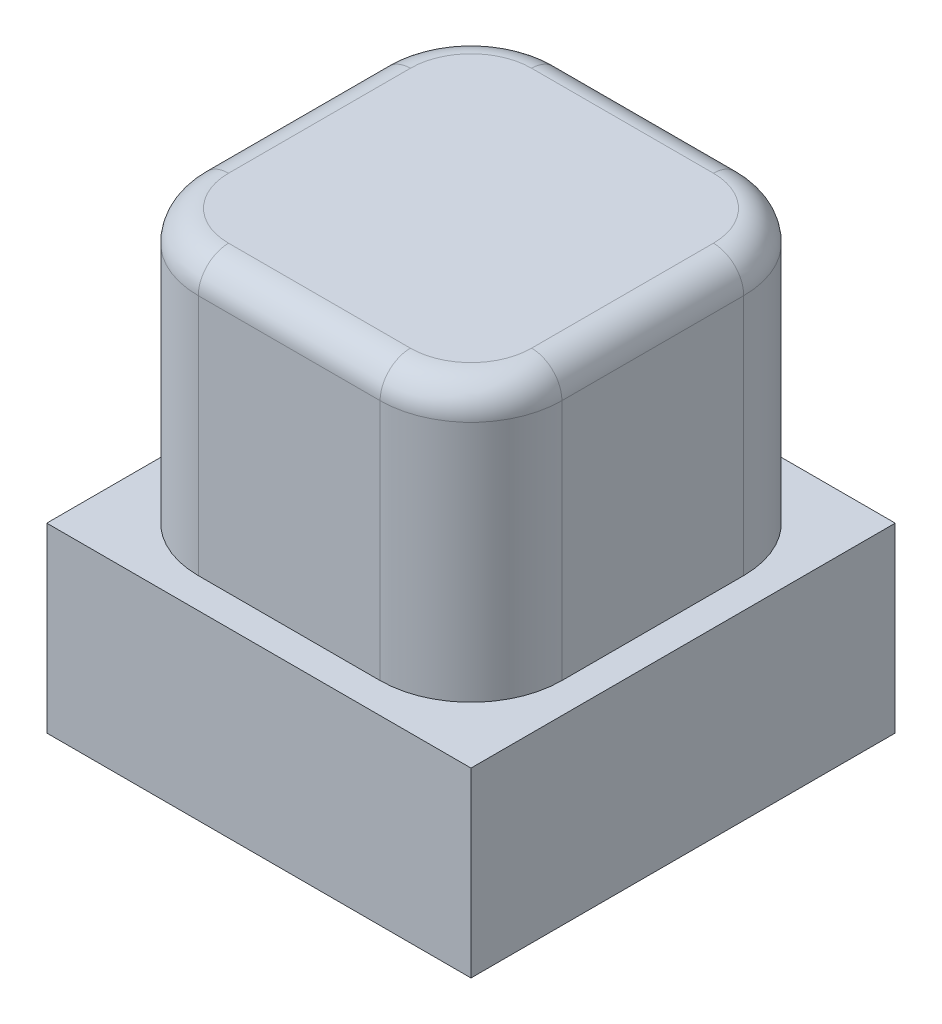
ISO-10303-21;
HEADER;
FILE_DESCRIPTION(('STEP AP214'),'2;1');
FILE_NAME('part.step','',(''),(''),'','','');
FILE_SCHEMA(('AUTOMOTIVE_DESIGN { 1 0 10303 214 1 1 1 1 }'));
ENDSEC;
DATA;
#1=APPLICATION_CONTEXT('core data for automotive mechanical design processes');
#2=APPLICATION_PROTOCOL_DEFINITION('international standard','automotive_design',2000,#1);
#3=PRODUCT_CONTEXT('',#1,'mechanical');
#4=PRODUCT('Part','Part','',(#3));
#5=PRODUCT_RELATED_PRODUCT_CATEGORY('part','',(#4));
#6=PRODUCT_DEFINITION_FORMATION('','',#4);
#7=PRODUCT_DEFINITION_CONTEXT('part definition',#1,'design');
#8=PRODUCT_DEFINITION('design','',#6,#7);
#9=PRODUCT_DEFINITION_SHAPE('','',#8);
#10=(LENGTH_UNIT() NAMED_UNIT(*) SI_UNIT(.MILLI.,.METRE.));
#11=(NAMED_UNIT(*) PLANE_ANGLE_UNIT() SI_UNIT($,.RADIAN.));
#12=(NAMED_UNIT(*) SI_UNIT($,.STERADIAN.) SOLID_ANGLE_UNIT());
#13=UNCERTAINTY_MEASURE_WITH_UNIT(LENGTH_MEASURE(1.E-05),#10,'distance_accuracy_value','');
#14=(GEOMETRIC_REPRESENTATION_CONTEXT(3) GLOBAL_UNCERTAINTY_ASSIGNED_CONTEXT((#13)) GLOBAL_UNIT_ASSIGNED_CONTEXT((#10,
#11,#12)) REPRESENTATION_CONTEXT('',''));
#15=CARTESIAN_POINT('',(0.,0.,0.));
#16=DIRECTION('',(0.,0.,1.));
#17=DIRECTION('',(1.,0.,0.));
#18=AXIS2_PLACEMENT_3D('',#15,#16,#17);
#19=CARTESIAN_POINT('',(3.5,-4.7,-3.5));
#20=DIRECTION('',(-1.,0.,0.));
#21=DIRECTION('',(0.,0.,1.));
#22=AXIS2_PLACEMENT_3D('',#19,#20,#21);
#23=PLANE('',#22);
#24=DIRECTION('',(0.,0.,1.));
#25=VECTOR('',#24,1.);
#26=CARTESIAN_POINT('',(3.5,-3.,3.5));
#27=LINE('',#26,#25);
#28=CARTESIAN_POINT('',(3.5,-3.,-3.5));
#29=VERTEX_POINT('',#28);
#30=CARTESIAN_POINT('',(3.5,-3.,3.5));
#31=VERTEX_POINT('',#30);
#32=EDGE_CURVE('E157',#29,#31,#27,.T.);
#33=ORIENTED_EDGE('',*,*,#32,.F.);
#34=DIRECTION('',(0.,1.,0.));
#35=VECTOR('',#34,1.);
#36=CARTESIAN_POINT('',(3.5,-4.7,-3.5));
#37=LINE('',#36,#35);
#38=CARTESIAN_POINT('',(3.5,0.,-3.5));
#39=VERTEX_POINT('',#38);
#40=EDGE_CURVE('E166',#29,#39,#37,.T.);
#41=ORIENTED_EDGE('',*,*,#40,.T.);
#42=DIRECTION('',(0.,0.,1.));
#43=VECTOR('',#42,1.);
#44=CARTESIAN_POINT('',(3.5,0.,-3.5));
#45=LINE('',#44,#43);
#46=CARTESIAN_POINT('',(3.5,0.,3.5));
#47=VERTEX_POINT('',#46);
#48=EDGE_CURVE('E573',#39,#47,#45,.T.);
#49=ORIENTED_EDGE('',*,*,#48,.T.);
#50=DIRECTION('',(0.,1.,0.));
#51=VECTOR('',#50,1.);
#52=CARTESIAN_POINT('',(3.5,-4.7,3.5));
#53=LINE('',#52,#51);
#54=EDGE_CURVE('E168',#31,#47,#53,.T.);
#55=ORIENTED_EDGE('',*,*,#54,.F.);
#56=EDGE_LOOP('',(#33,#41,#49,#55));
#57=FACE_BOUND('',#56,.T.);
#58=ADVANCED_FACE('F41',(#57),#23,.F.);
#59=CARTESIAN_POINT('',(-3.5,-4.7,3.5));
#60=DIRECTION('',(0.,0.,-1.));
#61=DIRECTION('',(-1.,0.,0.));
#62=AXIS2_PLACEMENT_3D('',#59,#60,#61);
#63=PLANE('',#62);
#64=DIRECTION('',(-1.,0.,0.));
#65=VECTOR('',#64,1.);
#66=CARTESIAN_POINT('',(-3.5,-3.,3.5));
#67=LINE('',#66,#65);
#68=CARTESIAN_POINT('',(-3.5,-3.,3.5));
#69=VERTEX_POINT('',#68);
#70=EDGE_CURVE('E169',#31,#69,#67,.T.);
#71=ORIENTED_EDGE('',*,*,#70,.F.);
#72=ORIENTED_EDGE('',*,*,#54,.T.);
#73=DIRECTION('',(-1.,0.,0.));
#74=VECTOR('',#73,1.);
#75=CARTESIAN_POINT('',(-3.5,0.,3.5));
#76=LINE('',#75,#74);
#77=CARTESIAN_POINT('',(-3.5,0.,3.5));
#78=VERTEX_POINT('',#77);
#79=EDGE_CURVE('E577',#47,#78,#76,.T.);
#80=ORIENTED_EDGE('',*,*,#79,.T.);
#81=DIRECTION('',(0.,1.,0.));
#82=VECTOR('',#81,1.);
#83=CARTESIAN_POINT('',(-3.5,-4.7,3.5));
#84=LINE('',#83,#82);
#85=EDGE_CURVE('E177',#69,#78,#84,.T.);
#86=ORIENTED_EDGE('',*,*,#85,.F.);
#87=EDGE_LOOP('',(#71,#72,#80,#86));
#88=FACE_BOUND('',#87,.T.);
#89=ADVANCED_FACE('F349',(#88),#63,.F.);
#90=CARTESIAN_POINT('',(-3.5,-4.7,-3.5));
#91=DIRECTION('',(1.,0.,0.));
#92=DIRECTION('',(0.,0.,-1.));
#93=AXIS2_PLACEMENT_3D('',#90,#91,#92);
#94=PLANE('',#93);
#95=DIRECTION('',(0.,0.,-1.));
#96=VECTOR('',#95,1.);
#97=CARTESIAN_POINT('',(-3.5,-3.,3.5));
#98=LINE('',#97,#96);
#99=CARTESIAN_POINT('',(-3.5,-3.,-3.5));
#100=VERTEX_POINT('',#99);
#101=EDGE_CURVE('E58',#69,#100,#98,.T.);
#102=ORIENTED_EDGE('',*,*,#101,.F.);
#103=ORIENTED_EDGE('',*,*,#85,.T.);
#104=DIRECTION('',(0.,0.,-1.));
#105=VECTOR('',#104,1.);
#106=CARTESIAN_POINT('',(-3.5,0.,-3.5));
#107=LINE('',#106,#105);
#108=CARTESIAN_POINT('',(-3.5,0.,-3.5));
#109=VERTEX_POINT('',#108);
#110=EDGE_CURVE('E179',#78,#109,#107,.T.);
#111=ORIENTED_EDGE('',*,*,#110,.T.);
#112=DIRECTION('',(0.,1.,0.));
#113=VECTOR('',#112,1.);
#114=CARTESIAN_POINT('',(-3.5,-4.7,-3.5));
#115=LINE('',#114,#113);
#116=EDGE_CURVE('E175',#100,#109,#115,.T.);
#117=ORIENTED_EDGE('',*,*,#116,.F.);
#118=EDGE_LOOP('',(#102,#103,#111,#117));
#119=FACE_BOUND('',#118,.T.);
#120=ADVANCED_FACE('F354',(#119),#94,.F.);
#121=CARTESIAN_POINT('',(-3.5,-4.7,-3.5));
#122=DIRECTION('',(0.,0.,1.));
#123=DIRECTION('',(1.,0.,0.));
#124=AXIS2_PLACEMENT_3D('',#121,#122,#123);
#125=PLANE('',#124);
#126=DIRECTION('',(1.,0.,0.));
#127=VECTOR('',#126,1.);
#128=CARTESIAN_POINT('',(-3.5,-3.,-3.5));
#129=LINE('',#128,#127);
#130=EDGE_CURVE('E153',#100,#29,#129,.T.);
#131=ORIENTED_EDGE('',*,*,#130,.F.);
#132=ORIENTED_EDGE('',*,*,#116,.T.);
#133=DIRECTION('',(1.,0.,0.));
#134=VECTOR('',#133,1.);
#135=CARTESIAN_POINT('',(-3.5,0.,-3.5));
#136=LINE('',#135,#134);
#137=EDGE_CURVE('E173',#109,#39,#136,.T.);
#138=ORIENTED_EDGE('',*,*,#137,.T.);
#139=ORIENTED_EDGE('',*,*,#40,.F.);
#140=EDGE_LOOP('',(#131,#132,#138,#139));
#141=FACE_BOUND('',#140,.T.);
#142=ADVANCED_FACE('F171',(#141),#125,.F.);
#143=CARTESIAN_POINT('',(3.,4.5,3.));
#144=DIRECTION('',(-1.,0.,0.));
#145=DIRECTION('',(0.,0.,1.));
#146=AXIS2_PLACEMENT_3D('',#143,#144,#145);
#147=PLANE('',#146);
#148=DIRECTION('',(0.,-1.,0.));
#149=VECTOR('',#148,1.);
#150=CARTESIAN_POINT('',(3.,4.5,-1.5));
#151=LINE('',#150,#149);
#152=CARTESIAN_POINT('',(3.,0.,-1.5));
#153=VERTEX_POINT('',#152);
#154=CARTESIAN_POINT('',(3.,4.,-1.5));
#155=VERTEX_POINT('',#154);
#156=EDGE_CURVE('E220',#153,#155,#151,.F.);
#157=ORIENTED_EDGE('',*,*,#156,.T.);
#158=DIRECTION('',(0.,0.,-1.));
#159=VECTOR('',#158,1.);
#160=CARTESIAN_POINT('',(3.,4.,3.));
#161=LINE('',#160,#159);
#162=CARTESIAN_POINT('',(3.,4.,1.5));
#163=VERTEX_POINT('',#162);
#164=EDGE_CURVE('E66',#155,#163,#161,.F.);
#165=ORIENTED_EDGE('',*,*,#164,.T.);
#166=DIRECTION('',(0.,-1.,0.));
#167=VECTOR('',#166,1.);
#168=CARTESIAN_POINT('',(3.,4.5,1.5));
#169=LINE('',#168,#167);
#170=CARTESIAN_POINT('',(3.,0.,1.5));
#171=VERTEX_POINT('',#170);
#172=EDGE_CURVE('E218',#163,#171,#169,.T.);
#173=ORIENTED_EDGE('',*,*,#172,.T.);
#174=DIRECTION('',(0.,0.,-1.));
#175=VECTOR('',#174,1.);
#176=CARTESIAN_POINT('',(3.,0.,3.));
#177=LINE('',#176,#175);
#178=EDGE_CURVE('E186',#171,#153,#177,.T.);
#179=ORIENTED_EDGE('',*,*,#178,.T.);
#180=EDGE_LOOP('',(#157,#165,#173,#179));
#181=FACE_BOUND('',#180,.T.);
#182=ADVANCED_FACE('F290',(#181),#147,.F.);
#183=CARTESIAN_POINT('',(-3.,4.5,-3.));
#184=DIRECTION('',(0.,0.,1.));
#185=DIRECTION('',(1.,0.,0.));
#186=AXIS2_PLACEMENT_3D('',#183,#184,#185);
#187=PLANE('',#186);
#188=DIRECTION('',(0.,-1.,0.));
#189=VECTOR('',#188,1.);
#190=CARTESIAN_POINT('',(-1.5,4.5,-3.));
#191=LINE('',#190,#189);
#192=CARTESIAN_POINT('',(-1.5,0.,-3.));
#193=VERTEX_POINT('',#192);
#194=CARTESIAN_POINT('',(-1.5,4.,-3.));
#195=VERTEX_POINT('',#194);
#196=EDGE_CURVE('E215',#193,#195,#191,.F.);
#197=ORIENTED_EDGE('',*,*,#196,.T.);
#198=DIRECTION('',(-1.,0.,0.));
#199=VECTOR('',#198,1.);
#200=CARTESIAN_POINT('',(-3.,4.,-3.));
#201=LINE('',#200,#199);
#202=CARTESIAN_POINT('',(1.5,4.,-3.));
#203=VERTEX_POINT('',#202);
#204=EDGE_CURVE('E253',#195,#203,#201,.F.);
#205=ORIENTED_EDGE('',*,*,#204,.T.);
#206=DIRECTION('',(0.,-1.,0.));
#207=VECTOR('',#206,1.);
#208=CARTESIAN_POINT('',(1.5,4.5,-3.));
#209=LINE('',#208,#207);
#210=CARTESIAN_POINT('',(1.5,0.,-3.));
#211=VERTEX_POINT('',#210);
#212=EDGE_CURVE('E213',#203,#211,#209,.T.);
#213=ORIENTED_EDGE('',*,*,#212,.T.);
#214=DIRECTION('',(-1.,0.,0.));
#215=VECTOR('',#214,1.);
#216=CARTESIAN_POINT('',(-3.,0.,-3.));
#217=LINE('',#216,#215);
#218=EDGE_CURVE('E188',#211,#193,#217,.T.);
#219=ORIENTED_EDGE('',*,*,#218,.T.);
#220=EDGE_LOOP('',(#197,#205,#213,#219));
#221=FACE_BOUND('',#220,.T.);
#222=ADVANCED_FACE('F301',(#221),#187,.F.);
#223=CARTESIAN_POINT('',(-3.,4.5,3.));
#224=DIRECTION('',(1.,0.,0.));
#225=DIRECTION('',(0.,0.,-1.));
#226=AXIS2_PLACEMENT_3D('',#223,#224,#225);
#227=PLANE('',#226);
#228=DIRECTION('',(0.,-1.,0.));
#229=VECTOR('',#228,1.);
#230=CARTESIAN_POINT('',(-3.,4.5,1.5));
#231=LINE('',#230,#229);
#232=CARTESIAN_POINT('',(-3.,0.,1.5));
#233=VERTEX_POINT('',#232);
#234=CARTESIAN_POINT('',(-3.,4.,1.5));
#235=VERTEX_POINT('',#234);
#236=EDGE_CURVE('E196',#233,#235,#231,.F.);
#237=ORIENTED_EDGE('',*,*,#236,.T.);
#238=DIRECTION('',(0.,0.,1.));
#239=VECTOR('',#238,1.);
#240=CARTESIAN_POINT('',(-3.,4.,3.));
#241=LINE('',#240,#239);
#242=CARTESIAN_POINT('',(-3.,4.,-1.5));
#243=VERTEX_POINT('',#242);
#244=EDGE_CURVE('E50',#235,#243,#241,.F.);
#245=ORIENTED_EDGE('',*,*,#244,.T.);
#246=DIRECTION('',(0.,-1.,0.));
#247=VECTOR('',#246,1.);
#248=CARTESIAN_POINT('',(-3.,4.5,-1.5));
#249=LINE('',#248,#247);
#250=CARTESIAN_POINT('',(-3.,0.,-1.5));
#251=VERTEX_POINT('',#250);
#252=EDGE_CURVE('E199',#243,#251,#249,.T.);
#253=ORIENTED_EDGE('',*,*,#252,.T.);
#254=DIRECTION('',(0.,0.,1.));
#255=VECTOR('',#254,1.);
#256=CARTESIAN_POINT('',(-3.,0.,3.));
#257=LINE('',#256,#255);
#258=EDGE_CURVE('E191',#251,#233,#257,.T.);
#259=ORIENTED_EDGE('',*,*,#258,.T.);
#260=EDGE_LOOP('',(#237,#245,#253,#259));
#261=FACE_BOUND('',#260,.T.);
#262=ADVANCED_FACE('F339',(#261),#227,.F.);
#263=CARTESIAN_POINT('',(-3.,4.5,3.));
#264=DIRECTION('',(0.,0.,-1.));
#265=DIRECTION('',(-1.,0.,0.));
#266=AXIS2_PLACEMENT_3D('',#263,#264,#265);
#267=PLANE('',#266);
#268=DIRECTION('',(0.,-1.,0.));
#269=VECTOR('',#268,1.);
#270=CARTESIAN_POINT('',(1.5,4.5,3.));
#271=LINE('',#270,#269);
#272=CARTESIAN_POINT('',(1.5,0.,3.));
#273=VERTEX_POINT('',#272);
#274=CARTESIAN_POINT('',(1.5,4.,3.));
#275=VERTEX_POINT('',#274);
#276=EDGE_CURVE('E224',#273,#275,#271,.F.);
#277=ORIENTED_EDGE('',*,*,#276,.T.);
#278=DIRECTION('',(1.,0.,0.));
#279=VECTOR('',#278,1.);
#280=CARTESIAN_POINT('',(-3.,4.,3.));
#281=LINE('',#280,#279);
#282=CARTESIAN_POINT('',(-1.5,4.,3.));
#283=VERTEX_POINT('',#282);
#284=EDGE_CURVE('E12',#275,#283,#281,.F.);
#285=ORIENTED_EDGE('',*,*,#284,.T.);
#286=DIRECTION('',(0.,-1.,0.));
#287=VECTOR('',#286,1.);
#288=CARTESIAN_POINT('',(-1.5,4.5,3.));
#289=LINE('',#288,#287);
#290=CARTESIAN_POINT('',(-1.5,0.,3.));
#291=VERTEX_POINT('',#290);
#292=EDGE_CURVE('E222',#283,#291,#289,.T.);
#293=ORIENTED_EDGE('',*,*,#292,.T.);
#294=DIRECTION('',(1.,0.,0.));
#295=VECTOR('',#294,1.);
#296=CARTESIAN_POINT('',(-3.,0.,3.));
#297=LINE('',#296,#295);
#298=EDGE_CURVE('E194',#291,#273,#297,.T.);
#299=ORIENTED_EDGE('',*,*,#298,.T.);
#300=EDGE_LOOP('',(#277,#285,#293,#299));
#301=FACE_BOUND('',#300,.T.);
#302=ADVANCED_FACE('F332',(#301),#267,.F.);
#303=CARTESIAN_POINT('',(0.,4.5,0.));
#304=DIRECTION('',(0.,-1.,0.));
#305=DIRECTION('',(0.,0.,-1.));
#306=AXIS2_PLACEMENT_3D('',#303,#304,#305);
#307=PLANE('',#306);
#308=CARTESIAN_POINT('',(1.5,4.5,-1.5));
#309=DIRECTION('',(0.,-1.,0.));
#310=DIRECTION('',(0.,0.,-1.));
#311=AXIS2_PLACEMENT_3D('',#308,#309,#310);
#312=CIRCLE('',#311,1.);
#313=CARTESIAN_POINT('',(2.5,4.5,-1.5));
#314=VERTEX_POINT('',#313);
#315=CARTESIAN_POINT('',(1.5,4.5,-2.5));
#316=VERTEX_POINT('',#315);
#317=EDGE_CURVE('E238',#314,#316,#312,.F.);
#318=ORIENTED_EDGE('',*,*,#317,.T.);
#319=DIRECTION('',(-1.,0.,0.));
#320=VECTOR('',#319,1.);
#321=CARTESIAN_POINT('',(0.,4.5,-2.5));
#322=LINE('',#321,#320);
#323=CARTESIAN_POINT('',(-1.5,4.5,-2.5));
#324=VERTEX_POINT('',#323);
#325=EDGE_CURVE('E242',#316,#324,#322,.T.);
#326=ORIENTED_EDGE('',*,*,#325,.T.);
#327=CARTESIAN_POINT('',(-1.5,4.5,-1.5));
#328=DIRECTION('',(0.,-1.,0.));
#329=DIRECTION('',(0.,0.,-1.));
#330=AXIS2_PLACEMENT_3D('',#327,#328,#329);
#331=CIRCLE('',#330,1.);
#332=CARTESIAN_POINT('',(-2.5,4.5,-1.5));
#333=VERTEX_POINT('',#332);
#334=EDGE_CURVE('E240',#324,#333,#331,.F.);
#335=ORIENTED_EDGE('',*,*,#334,.T.);
#336=DIRECTION('',(0.,0.,1.));
#337=VECTOR('',#336,1.);
#338=CARTESIAN_POINT('',(-2.5,4.5,0.));
#339=LINE('',#338,#337);
#340=CARTESIAN_POINT('',(-2.5,4.5,1.5));
#341=VERTEX_POINT('',#340);
#342=EDGE_CURVE('E234',#333,#341,#339,.T.);
#343=ORIENTED_EDGE('',*,*,#342,.T.);
#344=CARTESIAN_POINT('',(-1.5,4.5,1.5));
#345=DIRECTION('',(0.,-1.,0.));
#346=DIRECTION('',(0.,0.,-1.));
#347=AXIS2_PLACEMENT_3D('',#344,#345,#346);
#348=CIRCLE('',#347,1.);
#349=CARTESIAN_POINT('',(-1.5,4.5,2.5));
#350=VERTEX_POINT('',#349);
#351=EDGE_CURVE('E231',#341,#350,#348,.F.);
#352=ORIENTED_EDGE('',*,*,#351,.T.);
#353=DIRECTION('',(1.,0.,0.));
#354=VECTOR('',#353,1.);
#355=CARTESIAN_POINT('',(0.,4.5,2.5));
#356=LINE('',#355,#354);
#357=CARTESIAN_POINT('',(1.5,4.5,2.5));
#358=VERTEX_POINT('',#357);
#359=EDGE_CURVE('E227',#350,#358,#356,.T.);
#360=ORIENTED_EDGE('',*,*,#359,.T.);
#361=CARTESIAN_POINT('',(1.5,4.5,1.5));
#362=DIRECTION('',(0.,-1.,0.));
#363=DIRECTION('',(0.,0.,-1.));
#364=AXIS2_PLACEMENT_3D('',#361,#362,#363);
#365=CIRCLE('',#364,1.);
#366=CARTESIAN_POINT('',(2.5,4.5,1.5));
#367=VERTEX_POINT('',#366);
#368=EDGE_CURVE('E229',#358,#367,#365,.F.);
#369=ORIENTED_EDGE('',*,*,#368,.T.);
#370=DIRECTION('',(0.,0.,-1.));
#371=VECTOR('',#370,1.);
#372=CARTESIAN_POINT('',(2.5,4.5,0.));
#373=LINE('',#372,#371);
#374=EDGE_CURVE('E236',#367,#314,#373,.T.);
#375=ORIENTED_EDGE('',*,*,#374,.T.);
#376=EDGE_LOOP('',(#318,#326,#335,#343,#352,#360,#369,#375));
#377=FACE_BOUND('',#376,.T.);
#378=ADVANCED_FACE('F317',(#377),#307,.F.);
#379=CARTESIAN_POINT('',(-1.5,4.5,-1.5));
#380=DIRECTION('',(0.,-1.,0.));
#381=DIRECTION('',(0.,0.,-1.));
#382=AXIS2_PLACEMENT_3D('',#379,#380,#381);
#383=CYLINDRICAL_SURFACE('',#382,1.5);
#384=ORIENTED_EDGE('',*,*,#252,.F.);
#385=CARTESIAN_POINT('',(-1.5,4.,-1.5));
#386=DIRECTION('',(0.,-1.,0.));
#387=DIRECTION('',(0.,0.,-1.));
#388=AXIS2_PLACEMENT_3D('',#385,#386,#387);
#389=CIRCLE('',#388,1.5);
#390=EDGE_CURVE('E247',#243,#195,#389,.T.);
#391=ORIENTED_EDGE('',*,*,#390,.T.);
#392=ORIENTED_EDGE('',*,*,#196,.F.);
#393=CARTESIAN_POINT('',(-1.5,0.,-1.5));
#394=DIRECTION('',(0.,-1.,0.));
#395=DIRECTION('',(0.,0.,-1.));
#396=AXIS2_PLACEMENT_3D('',#393,#394,#395);
#397=CIRCLE('',#396,1.5);
#398=EDGE_CURVE('E210',#251,#193,#397,.T.);
#399=ORIENTED_EDGE('',*,*,#398,.F.);
#400=EDGE_LOOP('',(#384,#391,#392,#399));
#401=FACE_BOUND('',#400,.T.);
#402=ADVANCED_FACE('F304',(#401),#383,.T.);
#403=CARTESIAN_POINT('',(1.5,4.5,-1.5));
#404=DIRECTION('',(0.,-1.,0.));
#405=DIRECTION('',(0.,0.,-1.));
#406=AXIS2_PLACEMENT_3D('',#403,#404,#405);
#407=CYLINDRICAL_SURFACE('',#406,1.5);
#408=ORIENTED_EDGE('',*,*,#212,.F.);
#409=CARTESIAN_POINT('',(1.5,4.,-1.5));
#410=DIRECTION('',(0.,-1.,0.));
#411=DIRECTION('',(0.,0.,-1.));
#412=AXIS2_PLACEMENT_3D('',#409,#410,#411);
#413=CIRCLE('',#412,1.5);
#414=EDGE_CURVE('E249',#203,#155,#413,.T.);
#415=ORIENTED_EDGE('',*,*,#414,.T.);
#416=ORIENTED_EDGE('',*,*,#156,.F.);
#417=CARTESIAN_POINT('',(1.5,0.,-1.5));
#418=DIRECTION('',(0.,-1.,0.));
#419=DIRECTION('',(0.,0.,-1.));
#420=AXIS2_PLACEMENT_3D('',#417,#418,#419);
#421=CIRCLE('',#420,1.5);
#422=EDGE_CURVE('E207',#211,#153,#421,.T.);
#423=ORIENTED_EDGE('',*,*,#422,.F.);
#424=EDGE_LOOP('',(#408,#415,#416,#423));
#425=FACE_BOUND('',#424,.T.);
#426=ADVANCED_FACE('F288',(#425),#407,.T.);
#427=CARTESIAN_POINT('',(1.5,4.5,1.5));
#428=DIRECTION('',(0.,-1.,0.));
#429=DIRECTION('',(0.,0.,-1.));
#430=AXIS2_PLACEMENT_3D('',#427,#428,#429);
#431=CYLINDRICAL_SURFACE('',#430,1.5);
#432=ORIENTED_EDGE('',*,*,#172,.F.);
#433=CARTESIAN_POINT('',(1.5,4.,1.5));
#434=DIRECTION('',(0.,-1.,0.));
#435=DIRECTION('',(0.,0.,-1.));
#436=AXIS2_PLACEMENT_3D('',#433,#434,#435);
#437=CIRCLE('',#436,1.5);
#438=EDGE_CURVE('E251',#163,#275,#437,.T.);
#439=ORIENTED_EDGE('',*,*,#438,.T.);
#440=ORIENTED_EDGE('',*,*,#276,.F.);
#441=CARTESIAN_POINT('',(1.5,0.,1.5));
#442=DIRECTION('',(0.,-1.,0.));
#443=DIRECTION('',(0.,0.,-1.));
#444=AXIS2_PLACEMENT_3D('',#441,#442,#443);
#445=CIRCLE('',#444,1.5);
#446=EDGE_CURVE('E204',#171,#273,#445,.T.);
#447=ORIENTED_EDGE('',*,*,#446,.F.);
#448=EDGE_LOOP('',(#432,#439,#440,#447));
#449=FACE_BOUND('',#448,.T.);
#450=ADVANCED_FACE('F330',(#449),#431,.T.);
#451=CARTESIAN_POINT('',(-1.5,4.5,1.5));
#452=DIRECTION('',(0.,-1.,0.));
#453=DIRECTION('',(0.,0.,-1.));
#454=AXIS2_PLACEMENT_3D('',#451,#452,#453);
#455=CYLINDRICAL_SURFACE('',#454,1.5);
#456=ORIENTED_EDGE('',*,*,#292,.F.);
#457=CARTESIAN_POINT('',(-1.5,4.,1.5));
#458=DIRECTION('',(0.,-1.,0.));
#459=DIRECTION('',(0.,0.,-1.));
#460=AXIS2_PLACEMENT_3D('',#457,#458,#459);
#461=CIRCLE('',#460,1.5);
#462=EDGE_CURVE('E244',#283,#235,#461,.T.);
#463=ORIENTED_EDGE('',*,*,#462,.T.);
#464=ORIENTED_EDGE('',*,*,#236,.F.);
#465=CARTESIAN_POINT('',(-1.5,0.,1.5));
#466=DIRECTION('',(0.,-1.,0.));
#467=DIRECTION('',(0.,0.,-1.));
#468=AXIS2_PLACEMENT_3D('',#465,#466,#467);
#469=CIRCLE('',#468,1.5);
#470=EDGE_CURVE('E201',#291,#233,#469,.T.);
#471=ORIENTED_EDGE('',*,*,#470,.F.);
#472=EDGE_LOOP('',(#456,#463,#464,#471));
#473=FACE_BOUND('',#472,.T.);
#474=ADVANCED_FACE('F336',(#473),#455,.T.);
#475=CARTESIAN_POINT('',(1.5,4.,-1.5));
#476=DIRECTION('',(0.,-1.,0.));
#477=DIRECTION('',(0.,0.,-1.));
#478=AXIS2_PLACEMENT_3D('',#475,#476,#477);
#479=TOROIDAL_SURFACE('',#478,1.,0.5);
#480=CARTESIAN_POINT('',(2.5,4.,-1.5));
#481=DIRECTION('',(0.,0.,1.));
#482=DIRECTION('',(1.,0.,0.));
#483=AXIS2_PLACEMENT_3D('',#480,#481,#482);
#484=CIRCLE('',#483,0.5);
#485=EDGE_CURVE('E272',#155,#314,#484,.T.);
#486=ORIENTED_EDGE('',*,*,#485,.F.);
#487=ORIENTED_EDGE('',*,*,#414,.F.);
#488=CARTESIAN_POINT('',(1.5,4.,-2.5));
#489=DIRECTION('',(-1.,0.,0.));
#490=DIRECTION('',(0.,0.,1.));
#491=AXIS2_PLACEMENT_3D('',#488,#489,#490);
#492=CIRCLE('',#491,0.5);
#493=EDGE_CURVE('E189',#316,#203,#492,.T.);
#494=ORIENTED_EDGE('',*,*,#493,.F.);
#495=ORIENTED_EDGE('',*,*,#317,.F.);
#496=EDGE_LOOP('',(#486,#487,#494,#495));
#497=FACE_BOUND('',#496,.T.);
#498=ADVANCED_FACE('F43',(#497),#479,.T.);
#499=CARTESIAN_POINT('',(0.,4.,-2.5));
#500=DIRECTION('',(-1.,0.,0.));
#501=DIRECTION('',(0.,0.,1.));
#502=AXIS2_PLACEMENT_3D('',#499,#500,#501);
#503=CYLINDRICAL_SURFACE('',#502,0.5);
#504=ORIENTED_EDGE('',*,*,#493,.T.);
#505=ORIENTED_EDGE('',*,*,#204,.F.);
#506=CARTESIAN_POINT('',(-1.5,4.,-2.5));
#507=DIRECTION('',(-1.,0.,0.));
#508=DIRECTION('',(0.,0.,1.));
#509=AXIS2_PLACEMENT_3D('',#506,#507,#508);
#510=CIRCLE('',#509,0.5);
#511=EDGE_CURVE('E269',#324,#195,#510,.T.);
#512=ORIENTED_EDGE('',*,*,#511,.F.);
#513=ORIENTED_EDGE('',*,*,#325,.F.);
#514=EDGE_LOOP('',(#504,#505,#512,#513));
#515=FACE_BOUND('',#514,.T.);
#516=ADVANCED_FACE('F279',(#515),#503,.T.);
#517=CARTESIAN_POINT('',(2.5,4.,0.));
#518=DIRECTION('',(0.,0.,-1.));
#519=DIRECTION('',(-1.,0.,0.));
#520=AXIS2_PLACEMENT_3D('',#517,#518,#519);
#521=CYLINDRICAL_SURFACE('',#520,0.5);
#522=ORIENTED_EDGE('',*,*,#485,.T.);
#523=ORIENTED_EDGE('',*,*,#374,.F.);
#524=CARTESIAN_POINT('',(2.5,4.,1.5));
#525=DIRECTION('',(0.,0.,1.));
#526=DIRECTION('',(1.,0.,0.));
#527=AXIS2_PLACEMENT_3D('',#524,#525,#526);
#528=CIRCLE('',#527,0.5);
#529=EDGE_CURVE('E266',#163,#367,#528,.T.);
#530=ORIENTED_EDGE('',*,*,#529,.F.);
#531=ORIENTED_EDGE('',*,*,#164,.F.);
#532=EDGE_LOOP('',(#522,#523,#530,#531));
#533=FACE_BOUND('',#532,.T.);
#534=ADVANCED_FACE('F322',(#533),#521,.T.);
#535=CARTESIAN_POINT('',(-1.5,4.,-1.5));
#536=DIRECTION('',(0.,-1.,0.));
#537=DIRECTION('',(0.,0.,-1.));
#538=AXIS2_PLACEMENT_3D('',#535,#536,#537);
#539=TOROIDAL_SURFACE('',#538,1.,0.5);
#540=ORIENTED_EDGE('',*,*,#511,.T.);
#541=ORIENTED_EDGE('',*,*,#390,.F.);
#542=CARTESIAN_POINT('',(-2.5,4.,-1.5));
#543=DIRECTION('',(0.,0.,1.));
#544=DIRECTION('',(1.,0.,0.));
#545=AXIS2_PLACEMENT_3D('',#542,#543,#544);
#546=CIRCLE('',#545,0.5);
#547=EDGE_CURVE('E263',#333,#243,#546,.T.);
#548=ORIENTED_EDGE('',*,*,#547,.F.);
#549=ORIENTED_EDGE('',*,*,#334,.F.);
#550=EDGE_LOOP('',(#540,#541,#548,#549));
#551=FACE_BOUND('',#550,.T.);
#552=ADVANCED_FACE('F308',(#551),#539,.T.);
#553=CARTESIAN_POINT('',(1.5,4.,1.5));
#554=DIRECTION('',(0.,-1.,0.));
#555=DIRECTION('',(0.,0.,-1.));
#556=AXIS2_PLACEMENT_3D('',#553,#554,#555);
#557=TOROIDAL_SURFACE('',#556,1.,0.5);
#558=ORIENTED_EDGE('',*,*,#529,.T.);
#559=ORIENTED_EDGE('',*,*,#368,.F.);
#560=CARTESIAN_POINT('',(1.5,4.,2.5));
#561=DIRECTION('',(-1.,0.,0.));
#562=DIRECTION('',(0.,0.,1.));
#563=AXIS2_PLACEMENT_3D('',#560,#561,#562);
#564=CIRCLE('',#563,0.5);
#565=EDGE_CURVE('E260',#275,#358,#564,.T.);
#566=ORIENTED_EDGE('',*,*,#565,.F.);
#567=ORIENTED_EDGE('',*,*,#438,.F.);
#568=EDGE_LOOP('',(#558,#559,#566,#567));
#569=FACE_BOUND('',#568,.T.);
#570=ADVANCED_FACE('F325',(#569),#557,.T.);
#571=CARTESIAN_POINT('',(-2.5,4.,0.));
#572=DIRECTION('',(0.,0.,1.));
#573=DIRECTION('',(1.,0.,0.));
#574=AXIS2_PLACEMENT_3D('',#571,#572,#573);
#575=CYLINDRICAL_SURFACE('',#574,0.5);
#576=ORIENTED_EDGE('',*,*,#547,.T.);
#577=ORIENTED_EDGE('',*,*,#244,.F.);
#578=CARTESIAN_POINT('',(-2.5,4.,1.5));
#579=DIRECTION('',(0.,0.,1.));
#580=DIRECTION('',(1.,0.,0.));
#581=AXIS2_PLACEMENT_3D('',#578,#579,#580);
#582=CIRCLE('',#581,0.5);
#583=EDGE_CURVE('E258',#341,#235,#582,.T.);
#584=ORIENTED_EDGE('',*,*,#583,.F.);
#585=ORIENTED_EDGE('',*,*,#342,.F.);
#586=EDGE_LOOP('',(#576,#577,#584,#585));
#587=FACE_BOUND('',#586,.T.);
#588=ADVANCED_FACE('F313',(#587),#575,.T.);
#589=CARTESIAN_POINT('',(0.,4.,2.5));
#590=DIRECTION('',(1.,0.,0.));
#591=DIRECTION('',(0.,0.,-1.));
#592=AXIS2_PLACEMENT_3D('',#589,#590,#591);
#593=CYLINDRICAL_SURFACE('',#592,0.5);
#594=ORIENTED_EDGE('',*,*,#565,.T.);
#595=ORIENTED_EDGE('',*,*,#359,.F.);
#596=CARTESIAN_POINT('',(-1.5,4.,2.5));
#597=DIRECTION('',(-1.,0.,0.));
#598=DIRECTION('',(0.,0.,1.));
#599=AXIS2_PLACEMENT_3D('',#596,#597,#598);
#600=CIRCLE('',#599,0.5);
#601=EDGE_CURVE('E185',#283,#350,#600,.T.);
#602=ORIENTED_EDGE('',*,*,#601,.F.);
#603=ORIENTED_EDGE('',*,*,#284,.F.);
#604=EDGE_LOOP('',(#594,#595,#602,#603));
#605=FACE_BOUND('',#604,.T.);
#606=ADVANCED_FACE('F377',(#605),#593,.T.);
#607=CARTESIAN_POINT('',(-1.5,4.,1.5));
#608=DIRECTION('',(0.,-1.,0.));
#609=DIRECTION('',(0.,0.,-1.));
#610=AXIS2_PLACEMENT_3D('',#607,#608,#609);
#611=TOROIDAL_SURFACE('',#610,1.,0.5);
#612=ORIENTED_EDGE('',*,*,#583,.T.);
#613=ORIENTED_EDGE('',*,*,#462,.F.);
#614=ORIENTED_EDGE('',*,*,#601,.T.);
#615=ORIENTED_EDGE('',*,*,#351,.F.);
#616=EDGE_LOOP('',(#612,#613,#614,#615));
#617=FACE_BOUND('',#616,.T.);
#618=ADVANCED_FACE('F374',(#617),#611,.T.);
#619=CARTESIAN_POINT('',(0.,0.,0.));
#620=DIRECTION('',(0.,1.,0.));
#621=DIRECTION('',(0.,0.,1.));
#622=AXIS2_PLACEMENT_3D('',#619,#620,#621);
#623=PLANE('',#622);
#624=ORIENTED_EDGE('',*,*,#48,.F.);
#625=ORIENTED_EDGE('',*,*,#137,.F.);
#626=ORIENTED_EDGE('',*,*,#110,.F.);
#627=ORIENTED_EDGE('',*,*,#79,.F.);
#628=EDGE_LOOP('',(#624,#625,#626,#627));
#629=FACE_BOUND('',#628,.T.);
#630=ORIENTED_EDGE('',*,*,#258,.F.);
#631=ORIENTED_EDGE('',*,*,#398,.T.);
#632=ORIENTED_EDGE('',*,*,#218,.F.);
#633=ORIENTED_EDGE('',*,*,#422,.T.);
#634=ORIENTED_EDGE('',*,*,#178,.F.);
#635=ORIENTED_EDGE('',*,*,#446,.T.);
#636=ORIENTED_EDGE('',*,*,#298,.F.);
#637=ORIENTED_EDGE('',*,*,#470,.T.);
#638=EDGE_LOOP('',(#630,#631,#632,#633,#634,#635,#636,#637));
#639=FACE_BOUND('',#638,.T.);
#640=ADVANCED_FACE('F295',(#629,#639),#623,.T.);
#641=CARTESIAN_POINT('',(0.,-3.,0.));
#642=DIRECTION('',(0.,-1.,0.));
#643=DIRECTION('',(0.,0.,-1.));
#644=AXIS2_PLACEMENT_3D('',#641,#642,#643);
#645=PLANE('',#644);
#646=ORIENTED_EDGE('',*,*,#101,.T.);
#647=ORIENTED_EDGE('',*,*,#130,.T.);
#648=ORIENTED_EDGE('',*,*,#32,.T.);
#649=ORIENTED_EDGE('',*,*,#70,.T.);
#650=EDGE_LOOP('',(#646,#647,#648,#649));
#651=FACE_BOUND('',#650,.T.);
#652=CARTESIAN_POINT('',(0.,-3.,0.));
#653=DIRECTION('',(0.,1.,0.));
#654=DIRECTION('',(0.,0.,1.));
#655=AXIS2_PLACEMENT_3D('',#652,#653,#654);
#656=CIRCLE('',#655,1.95871417687583);
#657=CARTESIAN_POINT('',(1.95688563723905,-3.,0.084615775490571));
#658=VERTEX_POINT('',#657);
#659=EDGE_CURVE('E45',#658,#658,#656,.T.);
#660=ORIENTED_EDGE('',*,*,#659,.T.);
#661=EDGE_LOOP('',(#660));
#662=FACE_BOUND('',#661,.T.);
#663=ADVANCED_FACE('F155',(#651,#662),#645,.T.);
#664=CARTESIAN_POINT('',(0.,0.3,0.));
#665=DIRECTION('',(0.,1.,0.));
#666=DIRECTION('',(0.,0.,1.));
#667=AXIS2_PLACEMENT_3D('',#664,#665,#666);
#668=PLANE('',#667);
#669=CARTESIAN_POINT('',(0.,0.3,0.));
#670=DIRECTION('',(0.,1.,0.));
#671=DIRECTION('',(0.,0.,1.));
#672=AXIS2_PLACEMENT_3D('',#669,#670,#671);
#673=CIRCLE('',#672,1.9);
#674=CARTESIAN_POINT('',(1.87375170335896,0.3,0.314729334761466));
#675=VERTEX_POINT('',#674);
#676=EDGE_CURVE('E565',#675,#675,#673,.T.);
#677=ORIENTED_EDGE('',*,*,#676,.F.);
#678=EDGE_LOOP('',(#677));
#679=FACE_BOUND('',#678,.T.);
#680=ADVANCED_FACE('F506',(#679),#668,.F.);
#681=CARTESIAN_POINT('',(1.99971220923789,-4.7,-0.0339275732247386));
#682=CARTESIAN_POINT('',(1.87375170335896,0.3,0.314729334761466));
#683=CARTESIAN_POINT('',(1.93185706278841,-4.7,-4.03335199170052));
#684=CARTESIAN_POINT('',(2.50321037288189,0.3,-3.43277407195645));
#685=CARTESIAN_POINT('',(-2.06756735568737,-4.7,-3.96549684525104));
#686=CARTESIAN_POINT('',(-1.24429303383603,0.3,-4.06223274147939));
#687=CARTESIAN_POINT('',(-1.99971220923789,-4.7,0.0339275732247389));
#688=CARTESIAN_POINT('',(-1.87375170335896,0.3,-0.314729334761467));
#689=CARTESIAN_POINT('',(-1.93185706278841,-4.7,4.03335199170052));
#690=CARTESIAN_POINT('',(-2.50321037288189,0.3,3.43277407195645));
#691=CARTESIAN_POINT('',(2.06756735568737,-4.7,3.96549684525104));
#692=CARTESIAN_POINT('',(1.24429303383603,0.3,4.06223274147939));
#693=CARTESIAN_POINT('',(1.99971220923789,-4.7,-0.0339275732247386));
#694=CARTESIAN_POINT('',(1.87375170335896,0.3,0.314729334761466));
#695=(BOUNDED_SURFACE() B_SPLINE_SURFACE(3,1,((#681,#682),(#683,#684),(#685,#686),(#687,#688),
(#689,#690),(#691,#692),(#693,#694)),.UNSPECIFIED.,.T.,.F.,.F.) B_SPLINE_SURFACE_WITH_KNOTS((4,
3,4),(2,2),(0.,0.5,1.),(0.,1.),
.UNSPECIFIED.) GEOMETRIC_REPRESENTATION_ITEM() RATIONAL_B_SPLINE_SURFACE(((1.,1.),
(0.333333333333333,0.333333333333333),(0.333333333333333,0.333333333333333),(1.,1.),
(0.333333333333333,0.333333333333333),(0.333333333333333,0.333333333333333),(1.,1.))) REPRESENTATION_ITEM('') SURFACE());
#696=CARTESIAN_POINT('',(1.87375170335896,0.3,0.314729334761466));
#697=CARTESIAN_POINT('',(1.87461768183688,0.265625,0.312332318519061));
#698=CARTESIAN_POINT('',(1.8754836603148,0.23125,0.309935302276656));
#699=CARTESIAN_POINT('',(1.87721561727063,0.1625,0.305141269791846));
#700=CARTESIAN_POINT('',(1.87808159574855,0.128125,0.302744253549441));
#701=CARTESIAN_POINT('',(1.87981355270438,0.0593749999999999,0.29795022106463));
#702=CARTESIAN_POINT('',(1.8806795311823,0.0249999999999999,0.295553204822225));
#703=CARTESIAN_POINT('',(1.88241148813814,-0.0437500000000001,0.290759172337415));
#704=CARTESIAN_POINT('',(1.88327746661605,-0.0781250000000001,0.28836215609501));
#705=CARTESIAN_POINT('',(1.88500942357189,-0.146875,0.283568123610199));
#706=CARTESIAN_POINT('',(1.88587540204981,-0.18125,0.281171107367794));
#707=CARTESIAN_POINT('',(1.88760735900564,-0.25,0.276377074882984));
#708=CARTESIAN_POINT('',(1.88847333748356,-0.284375,0.273980058640579));
#709=CARTESIAN_POINT('',(1.8902052944394,-0.353125,0.269186026155768));
#710=CARTESIAN_POINT('',(1.89107127291731,-0.3875,0.266789009913363));
#711=CARTESIAN_POINT('',(1.89280322987315,-0.45625,0.261994977428553));
#712=CARTESIAN_POINT('',(1.89366920835107,-0.490625,0.259597961186148));
#713=CARTESIAN_POINT('',(1.8954011653069,-0.559375,0.254803928701337));
#714=CARTESIAN_POINT('',(1.89626714378482,-0.59375,0.252406912458932));
#715=CARTESIAN_POINT('',(1.89799910074065,-0.6625,0.247612879974122));
#716=CARTESIAN_POINT('',(1.89886507921857,-0.696875,0.245215863731717));
#717=CARTESIAN_POINT('',(1.90059703617441,-0.765625,0.240421831246906));
#718=CARTESIAN_POINT('',(1.90146301465232,-0.8,0.238024815004501));
#719=CARTESIAN_POINT('',(1.90319497160816,-0.86875,0.233230782519691));
#720=CARTESIAN_POINT('',(1.90406095008608,-0.903125,0.230833766277286));
#721=CARTESIAN_POINT('',(1.90579290704191,-0.971875,0.226039733792475));
#722=CARTESIAN_POINT('',(1.90665888551983,-1.00625,0.22364271755007));
#723=CARTESIAN_POINT('',(1.90839084247567,-1.075,0.21884868506526));
#724=CARTESIAN_POINT('',(1.90925682095358,-1.109375,0.216451668822855));
#725=CARTESIAN_POINT('',(1.91098877790942,-1.178125,0.211657636338044));
#726=CARTESIAN_POINT('',(1.91185475638734,-1.2125,0.209260620095639));
#727=CARTESIAN_POINT('',(1.91358671334317,-1.28125,0.204466587610829));
#728=CARTESIAN_POINT('',(1.91445269182109,-1.315625,0.202069571368424));
#729=CARTESIAN_POINT('',(1.91618464877692,-1.384375,0.197275538883614));
#730=CARTESIAN_POINT('',(1.91705062725484,-1.41875,0.194878522641208));
#731=CARTESIAN_POINT('',(1.91878258421068,-1.4875,0.190084490156398));
#732=CARTESIAN_POINT('',(1.91964856268859,-1.521875,0.187687473913993));
#733=CARTESIAN_POINT('',(1.92138051964443,-1.590625,0.182893441429183));
#734=CARTESIAN_POINT('',(1.92224649812235,-1.625,0.180496425186777));
#735=CARTESIAN_POINT('',(1.92397845507818,-1.69375,0.175702392701967));
#736=CARTESIAN_POINT('',(1.9248444335561,-1.728125,0.173305376459562));
#737=CARTESIAN_POINT('',(1.92657639051194,-1.796875,0.168511343974752));
#738=CARTESIAN_POINT('',(1.92744236898985,-1.83125,0.166114327732346));
#739=CARTESIAN_POINT('',(1.92917432594569,-1.9,0.161320295247536));
#740=CARTESIAN_POINT('',(1.93004030442361,-1.934375,0.158923279005131));
#741=CARTESIAN_POINT('',(1.93177226137944,-2.003125,0.154129246520321));
#742=CARTESIAN_POINT('',(1.93263823985736,-2.0375,0.151732230277916));
#743=CARTESIAN_POINT('',(1.93437019681319,-2.10625,0.146938197793105));
#744=CARTESIAN_POINT('',(1.93523617529111,-2.140625,0.1445411815507));
#745=CARTESIAN_POINT('',(1.93696813224695,-2.209375,0.13974714906589));
#746=CARTESIAN_POINT('',(1.93783411072487,-2.24375,0.137350132823485));
#747=CARTESIAN_POINT('',(1.9395660676807,-2.3125,0.132556100338674));
#748=CARTESIAN_POINT('',(1.94043204615862,-2.346875,0.130159084096269));
#749=CARTESIAN_POINT('',(1.94216400311445,-2.415625,0.125365051611459));
#750=CARTESIAN_POINT('',(1.94302998159237,-2.45,0.122968035369054));
#751=CARTESIAN_POINT('',(1.94476193854821,-2.51875,0.118174002884243));
#752=CARTESIAN_POINT('',(1.94562791702612,-2.553125,0.115776986641838));
#753=CARTESIAN_POINT('',(1.94735987398196,-2.621875,0.110982954157028));
#754=CARTESIAN_POINT('',(1.94822585245988,-2.65625,0.108585937914623));
#755=CARTESIAN_POINT('',(1.94995780941571,-2.725,0.103791905429812));
#756=CARTESIAN_POINT('',(1.95082378789363,-2.759375,0.101394889187407));
#757=CARTESIAN_POINT('',(1.95255574484947,-2.828125,0.0966008567025968));
#758=CARTESIAN_POINT('',(1.95342172332738,-2.8625,0.0942038404601917));
#759=CARTESIAN_POINT('',(1.95515368028322,-2.93125,0.0894098079753814));
#760=CARTESIAN_POINT('',(1.95601965876114,-2.965625,0.0870127917329762));
#761=CARTESIAN_POINT('',(1.95688563723905,-3.,0.084615775490571));
#762=B_SPLINE_CURVE_WITH_KNOTS('',3,(#696,#697,#698,#699,#700,#701,#702,#703,#704,#705,#706,
#707,#708,#709,#710,#711,#712,#713,#714,#715,#716,#717,#718,#719,#720,#721,#722,#723,#724,#725,
#726,#727,#728,#729,#730,#731,#732,#733,#734,#735,#736,#737,#738,#739,#740,#741,#742,#743,#744,
#745,#746,#747,#748,#749,#750,#751,#752,#753,#754,#755,#756,#757,#758,#759,#760,#761),
.UNSPECIFIED.,.F.,.F.,(4,2,2,2,2,2,2,2,2,2,2,2,2,2,2,2,2,2,2,2,2,2,2,2,2,2,2,2,2,2,2,2,4),(0.,
0.1034080561432,0.206816112286399,0.310224168429599,0.413632224572799,0.517040280715999,
0.620448336859198,0.723856393002398,0.827264449145597,0.930672505288797,1.034080561432,
1.1374886175752,1.2408966737184,1.3443047298616,1.4477127860048,1.55112084214799,
1.65452889829119,1.75793695443439,1.86134501057759,1.96475306672079,2.06816112286399,
2.17156917900719,2.27497723515039,2.37838529129359,2.48179334743679,2.58520140357999,
2.68860945972319,2.79201751586639,2.89542557200959,2.99883362815279,3.10224168429599,
3.20564974043919,3.30905779658239),.UNSPECIFIED.);
#763=EDGE_CURVE('BSEAM514',#675,#658,#762,.T.);
#764=ORIENTED_EDGE('',*,*,#676,.T.);
#765=ORIENTED_EDGE('',*,*,#659,.F.);
#766=ORIENTED_EDGE('',*,*,#763,.T.);
#767=ORIENTED_EDGE('',*,*,#763,.F.);
#768=EDGE_LOOP('',(#764,#766,#765,#767));
#769=FACE_BOUND('',#768,.T.);
#770=ADVANCED_FACE('F514',(#769),#695,.F.);
#771=CLOSED_SHELL('',(#58,#89,#120,#142,#182,#222,#262,#302,#378,#402,#426,#450,#474,#498,#516,
#534,#552,#570,#588,#606,#618,#640,#663,#680,#770));
#772=MANIFOLD_SOLID_BREP('B2',#771);
#773=ADVANCED_BREP_SHAPE_REPRESENTATION('',(#18,#772),#14);
#774=SHAPE_DEFINITION_REPRESENTATION(#9,#773);
ENDSEC;
END-ISO-10303-21;
